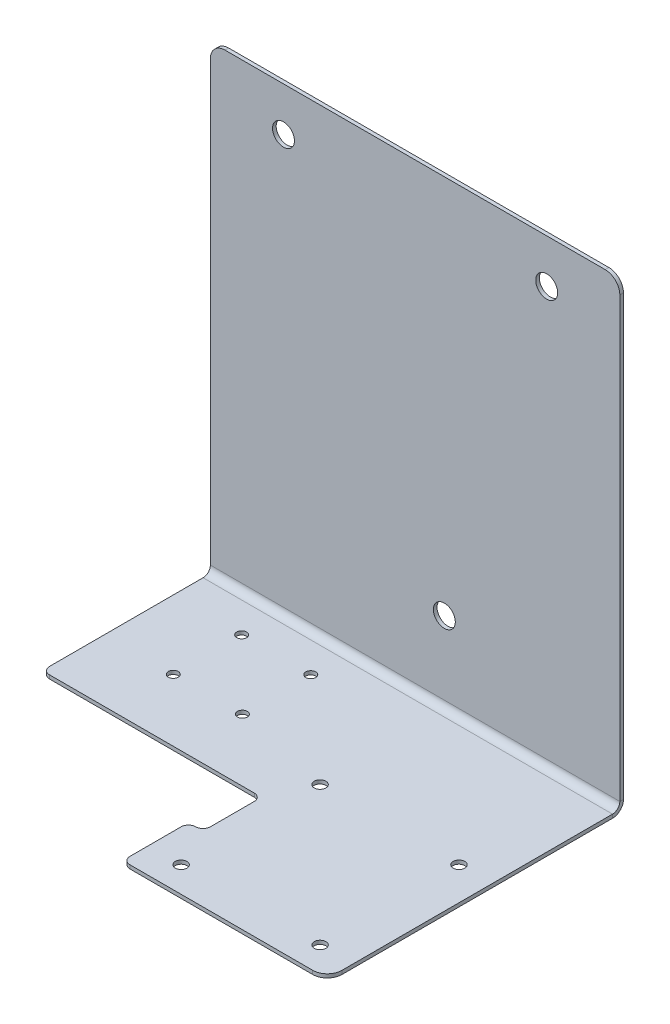
ISO-10303-21;
HEADER;
FILE_DESCRIPTION(('STEP AP214'),'2;1');
FILE_NAME('part.step','',(''),(''),'','','');
FILE_SCHEMA(('AUTOMOTIVE_DESIGN { 1 0 10303 214 1 1 1 1 }'));
ENDSEC;
DATA;
#1=APPLICATION_CONTEXT('core data for automotive mechanical design processes');
#2=APPLICATION_PROTOCOL_DEFINITION('international standard','automotive_design',2000,#1);
#3=PRODUCT_CONTEXT('',#1,'mechanical');
#4=PRODUCT('Part','Part','',(#3));
#5=PRODUCT_RELATED_PRODUCT_CATEGORY('part','',(#4));
#6=PRODUCT_DEFINITION_FORMATION('','',#4);
#7=PRODUCT_DEFINITION_CONTEXT('part definition',#1,'design');
#8=PRODUCT_DEFINITION('design','',#6,#7);
#9=PRODUCT_DEFINITION_SHAPE('','',#8);
#10=(LENGTH_UNIT() NAMED_UNIT(*) SI_UNIT(.MILLI.,.METRE.));
#11=(NAMED_UNIT(*) PLANE_ANGLE_UNIT() SI_UNIT($,.RADIAN.));
#12=(NAMED_UNIT(*) SI_UNIT($,.STERADIAN.) SOLID_ANGLE_UNIT());
#13=UNCERTAINTY_MEASURE_WITH_UNIT(LENGTH_MEASURE(1.E-05),#10,'distance_accuracy_value','');
#14=(GEOMETRIC_REPRESENTATION_CONTEXT(3) GLOBAL_UNCERTAINTY_ASSIGNED_CONTEXT((#13)) GLOBAL_UNIT_ASSIGNED_CONTEXT((#10,
#11,#12)) REPRESENTATION_CONTEXT('',''));
#15=CARTESIAN_POINT('',(0.,0.,0.));
#16=DIRECTION('',(0.,0.,1.));
#17=DIRECTION('',(1.,0.,0.));
#18=AXIS2_PLACEMENT_3D('',#15,#16,#17);
#19=CARTESIAN_POINT('',(82.55,95.25,3.175));
#20=DIRECTION('',(0.,0.,-1.));
#21=DIRECTION('',(-1.,0.,0.));
#22=AXIS2_PLACEMENT_3D('',#19,#20,#21);
#23=CYLINDRICAL_SURFACE('',#22,6.35);
#24=DIRECTION('',(0.,0.,1.));
#25=VECTOR('',#24,1.);
#26=CARTESIAN_POINT('',(88.9,95.25,3.175));
#27=LINE('',#26,#25);
#28=CARTESIAN_POINT('',(88.9,95.25,1.5875));
#29=VERTEX_POINT('',#28);
#30=CARTESIAN_POINT('',(88.9,95.25,3.175));
#31=VERTEX_POINT('',#30);
#32=EDGE_CURVE('E13',#29,#31,#27,.T.);
#33=ORIENTED_EDGE('',*,*,#32,.F.);
#34=CARTESIAN_POINT('',(82.55,95.25,1.5875));
#35=DIRECTION('',(0.,0.,-1.));
#36=DIRECTION('',(-1.,0.,0.));
#37=AXIS2_PLACEMENT_3D('',#34,#35,#36);
#38=CIRCLE('',#37,6.35);
#39=CARTESIAN_POINT('',(82.55,101.6,1.5875));
#40=VERTEX_POINT('',#39);
#41=EDGE_CURVE('E133',#29,#40,#38,.F.);
#42=ORIENTED_EDGE('',*,*,#41,.T.);
#43=DIRECTION('',(0.,0.,1.));
#44=VECTOR('',#43,1.);
#45=CARTESIAN_POINT('',(82.55,101.6,3.175));
#46=LINE('',#45,#44);
#47=CARTESIAN_POINT('',(82.55,101.6,3.175));
#48=VERTEX_POINT('',#47);
#49=EDGE_CURVE('E61',#40,#48,#46,.T.);
#50=ORIENTED_EDGE('',*,*,#49,.T.);
#51=CARTESIAN_POINT('',(82.55,95.25,3.175));
#52=DIRECTION('',(0.,0.,-1.));
#53=DIRECTION('',(-1.,0.,0.));
#54=AXIS2_PLACEMENT_3D('',#51,#52,#53);
#55=CIRCLE('',#54,6.35);
#56=EDGE_CURVE('E135',#31,#48,#55,.F.);
#57=ORIENTED_EDGE('',*,*,#56,.F.);
#58=EDGE_LOOP('',(#33,#42,#50,#57));
#59=FACE_BOUND('',#58,.T.);
#60=ADVANCED_FACE('F51',(#59),#23,.T.);
#61=CARTESIAN_POINT('',(-88.9,101.6,3.175));
#62=DIRECTION('',(0.,-1.,0.));
#63=DIRECTION('',(-1.,0.,0.));
#64=AXIS2_PLACEMENT_3D('',#61,#62,#63);
#65=PLANE('',#64);
#66=ORIENTED_EDGE('',*,*,#49,.F.);
#67=DIRECTION('',(-1.,0.,0.));
#68=VECTOR('',#67,1.);
#69=CARTESIAN_POINT('',(0.,101.6,1.5875));
#70=LINE('',#69,#68);
#71=CARTESIAN_POINT('',(-82.55,101.6,1.5875));
#72=VERTEX_POINT('',#71);
#73=EDGE_CURVE('E149',#40,#72,#70,.T.);
#74=ORIENTED_EDGE('',*,*,#73,.T.);
#75=DIRECTION('',(0.,0.,1.));
#76=VECTOR('',#75,1.);
#77=CARTESIAN_POINT('',(-82.55,101.6,3.175));
#78=LINE('',#77,#76);
#79=CARTESIAN_POINT('',(-82.55,101.6,3.175));
#80=VERTEX_POINT('',#79);
#81=EDGE_CURVE('E235',#72,#80,#78,.T.);
#82=ORIENTED_EDGE('',*,*,#81,.T.);
#83=DIRECTION('',(-1.,0.,0.));
#84=VECTOR('',#83,1.);
#85=CARTESIAN_POINT('',(-88.9,101.6,3.175));
#86=LINE('',#85,#84);
#87=EDGE_CURVE('E247',#48,#80,#86,.T.);
#88=ORIENTED_EDGE('',*,*,#87,.F.);
#89=EDGE_LOOP('',(#66,#74,#82,#88));
#90=FACE_BOUND('',#89,.T.);
#91=ADVANCED_FACE('F252',(#90),#65,.F.);
#92=CARTESIAN_POINT('',(-82.55,95.25,3.175));
#93=DIRECTION('',(0.,0.,-1.));
#94=DIRECTION('',(-1.,0.,0.));
#95=AXIS2_PLACEMENT_3D('',#92,#93,#94);
#96=CYLINDRICAL_SURFACE('',#95,6.35);
#97=ORIENTED_EDGE('',*,*,#81,.F.);
#98=CARTESIAN_POINT('',(-82.55,95.25,1.5875));
#99=DIRECTION('',(0.,0.,-1.));
#100=DIRECTION('',(-1.,0.,0.));
#101=AXIS2_PLACEMENT_3D('',#98,#99,#100);
#102=CIRCLE('',#101,6.35);
#103=CARTESIAN_POINT('',(-88.9,95.25,1.5875));
#104=VERTEX_POINT('',#103);
#105=EDGE_CURVE('E379',#72,#104,#102,.F.);
#106=ORIENTED_EDGE('',*,*,#105,.T.);
#107=DIRECTION('',(0.,0.,1.));
#108=VECTOR('',#107,1.);
#109=CARTESIAN_POINT('',(-88.9,95.25,3.175));
#110=LINE('',#109,#108);
#111=CARTESIAN_POINT('',(-88.9,95.25,3.175));
#112=VERTEX_POINT('',#111);
#113=EDGE_CURVE('E232',#104,#112,#110,.T.);
#114=ORIENTED_EDGE('',*,*,#113,.T.);
#115=CARTESIAN_POINT('',(-82.55,95.25,3.175));
#116=DIRECTION('',(0.,0.,-1.));
#117=DIRECTION('',(-1.,0.,0.));
#118=AXIS2_PLACEMENT_3D('',#115,#116,#117);
#119=CIRCLE('',#118,6.35);
#120=EDGE_CURVE('E253',#80,#112,#119,.F.);
#121=ORIENTED_EDGE('',*,*,#120,.F.);
#122=EDGE_LOOP('',(#97,#106,#114,#121));
#123=FACE_BOUND('',#122,.T.);
#124=ADVANCED_FACE('F382',(#123),#96,.T.);
#125=CARTESIAN_POINT('',(-88.9,-101.6,3.175));
#126=DIRECTION('',(1.,0.,0.));
#127=DIRECTION('',(0.,-1.,0.));
#128=AXIS2_PLACEMENT_3D('',#125,#126,#127);
#129=PLANE('',#128);
#130=ORIENTED_EDGE('',*,*,#113,.F.);
#131=DIRECTION('',(0.,1.,0.));
#132=VECTOR('',#131,1.);
#133=CARTESIAN_POINT('',(-88.9,0.,1.5875));
#134=LINE('',#133,#132);
#135=CARTESIAN_POINT('',(-88.9,-95.25,1.5875));
#136=VERTEX_POINT('',#135);
#137=EDGE_CURVE('E331',#104,#136,#134,.F.);
#138=ORIENTED_EDGE('',*,*,#137,.T.);
#139=DIRECTION('',(0.,0.,1.));
#140=VECTOR('',#139,1.);
#141=CARTESIAN_POINT('',(-88.9,-95.25,3.175));
#142=LINE('',#141,#140);
#143=CARTESIAN_POINT('',(-88.9,-95.25,3.175));
#144=VERTEX_POINT('',#143);
#145=EDGE_CURVE('E229',#136,#144,#142,.T.);
#146=ORIENTED_EDGE('',*,*,#145,.T.);
#147=DIRECTION('',(0.,-1.,0.));
#148=VECTOR('',#147,1.);
#149=CARTESIAN_POINT('',(-88.9,-101.6,3.175));
#150=LINE('',#149,#148);
#151=EDGE_CURVE('E255',#112,#144,#150,.T.);
#152=ORIENTED_EDGE('',*,*,#151,.F.);
#153=EDGE_LOOP('',(#130,#138,#146,#152));
#154=FACE_BOUND('',#153,.T.);
#155=ADVANCED_FACE('F386',(#154),#129,.F.);
#156=CARTESIAN_POINT('',(-88.9,-95.25,6.34999999999999));
#157=DIRECTION('',(-1.,0.,0.));
#158=DIRECTION('',(0.,0.,1.));
#159=AXIS2_PLACEMENT_3D('',#156,#157,#158);
#160=PLANE('',#159);
#161=ORIENTED_EDGE('',*,*,#145,.F.);
#162=CARTESIAN_POINT('',(-88.9,-95.25,6.34999999999999));
#163=DIRECTION('',(1.,0.,0.));
#164=DIRECTION('',(0.,0.,-1.));
#165=AXIS2_PLACEMENT_3D('',#162,#163,#164);
#166=CIRCLE('',#165,4.7625);
#167=CARTESIAN_POINT('',(-88.9,-100.0125,6.35));
#168=VERTEX_POINT('',#167);
#169=EDGE_CURVE('E339',#168,#136,#166,.T.);
#170=ORIENTED_EDGE('',*,*,#169,.F.);
#171=DIRECTION('',(0.,1.,0.));
#172=VECTOR('',#171,1.);
#173=CARTESIAN_POINT('',(-88.9,-98.425,6.34999999999999));
#174=LINE('',#173,#172);
#175=CARTESIAN_POINT('',(-88.9,-98.425,6.34999999999999));
#176=VERTEX_POINT('',#175);
#177=EDGE_CURVE('E69',#168,#176,#174,.T.);
#178=ORIENTED_EDGE('',*,*,#177,.T.);
#179=CARTESIAN_POINT('',(-88.9,-95.25,6.34999999999999));
#180=DIRECTION('',(1.,0.,0.));
#181=DIRECTION('',(0.,0.,-1.));
#182=AXIS2_PLACEMENT_3D('',#179,#180,#181);
#183=CIRCLE('',#182,3.175);
#184=EDGE_CURVE('E328',#176,#144,#183,.T.);
#185=ORIENTED_EDGE('',*,*,#184,.T.);
#186=EDGE_LOOP('',(#161,#170,#178,#185));
#187=FACE_BOUND('',#186,.T.);
#188=ADVANCED_FACE('F392',(#187),#160,.T.);
#189=CARTESIAN_POINT('',(-88.9,-98.425,130.175));
#190=DIRECTION('',(-1.,0.,0.));
#191=DIRECTION('',(0.,0.,-1.));
#192=AXIS2_PLACEMENT_3D('',#189,#190,#191);
#193=PLANE('',#192);
#194=ORIENTED_EDGE('',*,*,#177,.F.);
#195=DIRECTION('',(0.,0.,-1.));
#196=VECTOR('',#195,1.);
#197=CARTESIAN_POINT('',(-88.9,-100.0125,130.175));
#198=LINE('',#197,#196);
#199=CARTESIAN_POINT('',(-88.9,-100.0125,73.025));
#200=VERTEX_POINT('',#199);
#201=EDGE_CURVE('E187',#200,#168,#198,.T.);
#202=ORIENTED_EDGE('',*,*,#201,.F.);
#203=DIRECTION('',(0.,1.,0.));
#204=VECTOR('',#203,1.);
#205=CARTESIAN_POINT('',(-88.9,-98.425,73.025));
#206=LINE('',#205,#204);
#207=CARTESIAN_POINT('',(-88.9,-98.425,73.025));
#208=VERTEX_POINT('',#207);
#209=EDGE_CURVE('E225',#200,#208,#206,.T.);
#210=ORIENTED_EDGE('',*,*,#209,.T.);
#211=DIRECTION('',(0.,0.,-1.));
#212=VECTOR('',#211,1.);
#213=CARTESIAN_POINT('',(-88.9,-98.425,130.175));
#214=LINE('',#213,#212);
#215=EDGE_CURVE('E287',#208,#176,#214,.T.);
#216=ORIENTED_EDGE('',*,*,#215,.T.);
#217=EDGE_LOOP('',(#194,#202,#210,#216));
#218=FACE_BOUND('',#217,.T.);
#219=ADVANCED_FACE('F443',(#218),#193,.T.);
#220=CARTESIAN_POINT('',(-85.725,-98.425,73.025));
#221=DIRECTION('',(0.,-1.,0.));
#222=DIRECTION('',(0.,0.,-1.));
#223=AXIS2_PLACEMENT_3D('',#220,#221,#222);
#224=CYLINDRICAL_SURFACE('',#223,3.175);
#225=ORIENTED_EDGE('',*,*,#209,.F.);
#226=CARTESIAN_POINT('',(-85.725,-100.0125,73.025));
#227=DIRECTION('',(0.,-1.,0.));
#228=DIRECTION('',(0.,0.,-1.));
#229=AXIS2_PLACEMENT_3D('',#226,#227,#228);
#230=CIRCLE('',#229,3.175);
#231=CARTESIAN_POINT('',(-85.725,-100.0125,76.2));
#232=VERTEX_POINT('',#231);
#233=EDGE_CURVE('E369',#200,#232,#230,.F.);
#234=ORIENTED_EDGE('',*,*,#233,.T.);
#235=DIRECTION('',(0.,1.,0.));
#236=VECTOR('',#235,1.);
#237=CARTESIAN_POINT('',(-85.725,-98.425,76.2));
#238=LINE('',#237,#236);
#239=CARTESIAN_POINT('',(-85.725,-98.425,76.2));
#240=VERTEX_POINT('',#239);
#241=EDGE_CURVE('E222',#232,#240,#238,.T.);
#242=ORIENTED_EDGE('',*,*,#241,.T.);
#243=CARTESIAN_POINT('',(-85.725,-98.425,73.025));
#244=DIRECTION('',(0.,-1.,0.));
#245=DIRECTION('',(0.,0.,-1.));
#246=AXIS2_PLACEMENT_3D('',#243,#244,#245);
#247=CIRCLE('',#246,3.175);
#248=EDGE_CURVE('E289',#208,#240,#247,.F.);
#249=ORIENTED_EDGE('',*,*,#248,.F.);
#250=EDGE_LOOP('',(#225,#234,#242,#249));
#251=FACE_BOUND('',#250,.T.);
#252=ADVANCED_FACE('F447',(#251),#224,.T.);
#253=CARTESIAN_POINT('',(-88.9,-98.425,76.2));
#254=DIRECTION('',(0.,0.,-1.));
#255=DIRECTION('',(1.,0.,0.));
#256=AXIS2_PLACEMENT_3D('',#253,#254,#255);
#257=PLANE('',#256);
#258=ORIENTED_EDGE('',*,*,#241,.F.);
#259=DIRECTION('',(1.,0.,0.));
#260=VECTOR('',#259,1.);
#261=CARTESIAN_POINT('',(-88.9,-100.0125,76.2));
#262=LINE('',#261,#260);
#263=CARTESIAN_POINT('',(3.175,-100.0125,76.2));
#264=VERTEX_POINT('',#263);
#265=EDGE_CURVE('E366',#232,#264,#262,.T.);
#266=ORIENTED_EDGE('',*,*,#265,.T.);
#267=DIRECTION('',(0.,1.,0.));
#268=VECTOR('',#267,1.);
#269=CARTESIAN_POINT('',(3.175,-98.425,76.2));
#270=LINE('',#269,#268);
#271=CARTESIAN_POINT('',(3.175,-98.425,76.2));
#272=VERTEX_POINT('',#271);
#273=EDGE_CURVE('E219',#264,#272,#270,.T.);
#274=ORIENTED_EDGE('',*,*,#273,.T.);
#275=DIRECTION('',(1.,0.,0.));
#276=VECTOR('',#275,1.);
#277=CARTESIAN_POINT('',(-88.9,-98.425,76.2));
#278=LINE('',#277,#276);
#279=EDGE_CURVE('E292',#240,#272,#278,.T.);
#280=ORIENTED_EDGE('',*,*,#279,.F.);
#281=EDGE_LOOP('',(#258,#266,#274,#280));
#282=FACE_BOUND('',#281,.T.);
#283=ADVANCED_FACE('F449',(#282),#257,.F.);
#284=CARTESIAN_POINT('',(3.17499999999999,-98.425,79.375));
#285=DIRECTION('',(0.,-1.,0.));
#286=DIRECTION('',(0.,0.,-1.));
#287=AXIS2_PLACEMENT_3D('',#284,#285,#286);
#288=CYLINDRICAL_SURFACE('',#287,3.175);
#289=ORIENTED_EDGE('',*,*,#273,.F.);
#290=CARTESIAN_POINT('',(3.17499999999999,-100.0125,79.375));
#291=DIRECTION('',(0.,-1.,0.));
#292=DIRECTION('',(0.,0.,-1.));
#293=AXIS2_PLACEMENT_3D('',#290,#291,#292);
#294=CIRCLE('',#293,3.175);
#295=CARTESIAN_POINT('',(6.34999999999999,-100.0125,79.375));
#296=VERTEX_POINT('',#295);
#297=EDGE_CURVE('E363',#264,#296,#294,.T.);
#298=ORIENTED_EDGE('',*,*,#297,.T.);
#299=DIRECTION('',(0.,1.,0.));
#300=VECTOR('',#299,1.);
#301=CARTESIAN_POINT('',(6.35,-98.425,79.375));
#302=LINE('',#301,#300);
#303=CARTESIAN_POINT('',(6.35,-98.425,79.375));
#304=VERTEX_POINT('',#303);
#305=EDGE_CURVE('E216',#296,#304,#302,.T.);
#306=ORIENTED_EDGE('',*,*,#305,.T.);
#307=CARTESIAN_POINT('',(3.17499999999999,-98.425,79.375));
#308=DIRECTION('',(0.,-1.,0.));
#309=DIRECTION('',(0.,0.,-1.));
#310=AXIS2_PLACEMENT_3D('',#307,#308,#309);
#311=CIRCLE('',#310,3.175);
#312=EDGE_CURVE('E295',#272,#304,#311,.T.);
#313=ORIENTED_EDGE('',*,*,#312,.F.);
#314=EDGE_LOOP('',(#289,#298,#306,#313));
#315=FACE_BOUND('',#314,.T.);
#316=ADVANCED_FACE('F454',(#315),#288,.F.);
#317=CARTESIAN_POINT('',(6.35000000000001,-98.425,130.175));
#318=DIRECTION('',(1.,0.,0.));
#319=DIRECTION('',(0.,0.,1.));
#320=AXIS2_PLACEMENT_3D('',#317,#318,#319);
#321=PLANE('',#320);
#322=ORIENTED_EDGE('',*,*,#305,.F.);
#323=DIRECTION('',(0.,0.,-1.));
#324=VECTOR('',#323,1.);
#325=CARTESIAN_POINT('',(6.34999999999999,-100.0125,130.175));
#326=LINE('',#325,#324);
#327=CARTESIAN_POINT('',(6.35000000000001,-100.0125,98.425));
#328=VERTEX_POINT('',#327);
#329=EDGE_CURVE('E360',#296,#328,#326,.F.);
#330=ORIENTED_EDGE('',*,*,#329,.T.);
#331=DIRECTION('',(0.,1.,0.));
#332=VECTOR('',#331,1.);
#333=CARTESIAN_POINT('',(6.35,-98.425,98.425));
#334=LINE('',#333,#332);
#335=CARTESIAN_POINT('',(6.35,-98.425,98.425));
#336=VERTEX_POINT('',#335);
#337=EDGE_CURVE('E213',#328,#336,#334,.T.);
#338=ORIENTED_EDGE('',*,*,#337,.T.);
#339=DIRECTION('',(0.,0.,1.));
#340=VECTOR('',#339,1.);
#341=CARTESIAN_POINT('',(6.35000000000001,-98.425,130.175));
#342=LINE('',#341,#340);
#343=EDGE_CURVE('E298',#304,#336,#342,.T.);
#344=ORIENTED_EDGE('',*,*,#343,.F.);
#345=EDGE_LOOP('',(#322,#330,#338,#344));
#346=FACE_BOUND('',#345,.T.);
#347=ADVANCED_FACE('F459',(#346),#321,.F.);
#348=CARTESIAN_POINT('',(3.175,-98.425,98.425));
#349=DIRECTION('',(0.,-1.,0.));
#350=DIRECTION('',(0.,0.,-1.));
#351=AXIS2_PLACEMENT_3D('',#348,#349,#350);
#352=CYLINDRICAL_SURFACE('',#351,3.175);
#353=ORIENTED_EDGE('',*,*,#337,.F.);
#354=CARTESIAN_POINT('',(3.175,-100.0125,98.425));
#355=DIRECTION('',(0.,-1.,0.));
#356=DIRECTION('',(0.,0.,-1.));
#357=AXIS2_PLACEMENT_3D('',#354,#355,#356);
#358=CIRCLE('',#357,3.175);
#359=CARTESIAN_POINT('',(3.17499999999991,-100.0125,101.6));
#360=VERTEX_POINT('',#359);
#361=EDGE_CURVE('E357',#328,#360,#358,.T.);
#362=ORIENTED_EDGE('',*,*,#361,.T.);
#363=DIRECTION('',(0.,1.,0.));
#364=VECTOR('',#363,1.);
#365=CARTESIAN_POINT('',(3.17499999999991,-98.425,101.6));
#366=LINE('',#365,#364);
#367=CARTESIAN_POINT('',(3.17499999999991,-98.425,101.6));
#368=VERTEX_POINT('',#367);
#369=EDGE_CURVE('E210',#360,#368,#366,.T.);
#370=ORIENTED_EDGE('',*,*,#369,.T.);
#371=CARTESIAN_POINT('',(3.175,-98.425,98.425));
#372=DIRECTION('',(0.,-1.,0.));
#373=DIRECTION('',(0.,0.,-1.));
#374=AXIS2_PLACEMENT_3D('',#371,#372,#373);
#375=CIRCLE('',#374,3.175);
#376=EDGE_CURVE('E301',#336,#368,#375,.T.);
#377=ORIENTED_EDGE('',*,*,#376,.F.);
#378=EDGE_LOOP('',(#353,#362,#370,#377));
#379=FACE_BOUND('',#378,.T.);
#380=ADVANCED_FACE('F461',(#379),#352,.F.);
#381=CARTESIAN_POINT('',(3.17499999999992,-98.425,104.775));
#382=DIRECTION('',(0.,-1.,0.));
#383=DIRECTION('',(0.,0.,-1.));
#384=AXIS2_PLACEMENT_3D('',#381,#382,#383);
#385=CYLINDRICAL_SURFACE('',#384,3.175);
#386=ORIENTED_EDGE('',*,*,#369,.F.);
#387=CARTESIAN_POINT('',(3.17499999999992,-100.0125,104.775));
#388=DIRECTION('',(0.,-1.,0.));
#389=DIRECTION('',(0.,0.,-1.));
#390=AXIS2_PLACEMENT_3D('',#387,#388,#389);
#391=CIRCLE('',#390,3.175);
#392=CARTESIAN_POINT('',(0.,-100.0125,104.775));
#393=VERTEX_POINT('',#392);
#394=EDGE_CURVE('E354',#360,#393,#391,.F.);
#395=ORIENTED_EDGE('',*,*,#394,.T.);
#396=DIRECTION('',(0.,1.,0.));
#397=VECTOR('',#396,1.);
#398=CARTESIAN_POINT('',(0.,-98.425,104.775));
#399=LINE('',#398,#397);
#400=CARTESIAN_POINT('',(0.,-98.425,104.775));
#401=VERTEX_POINT('',#400);
#402=EDGE_CURVE('E207',#393,#401,#399,.T.);
#403=ORIENTED_EDGE('',*,*,#402,.T.);
#404=CARTESIAN_POINT('',(3.17499999999992,-98.425,104.775));
#405=DIRECTION('',(0.,-1.,0.));
#406=DIRECTION('',(0.,0.,-1.));
#407=AXIS2_PLACEMENT_3D('',#404,#405,#406);
#408=CIRCLE('',#407,3.175);
#409=EDGE_CURVE('E304',#368,#401,#408,.F.);
#410=ORIENTED_EDGE('',*,*,#409,.F.);
#411=EDGE_LOOP('',(#386,#395,#403,#410));
#412=FACE_BOUND('',#411,.T.);
#413=ADVANCED_FACE('F466',(#412),#385,.T.);
#414=CARTESIAN_POINT('',(0.,-98.425,130.175));
#415=DIRECTION('',(1.,0.,0.));
#416=DIRECTION('',(0.,0.,1.));
#417=AXIS2_PLACEMENT_3D('',#414,#415,#416);
#418=PLANE('',#417);
#419=ORIENTED_EDGE('',*,*,#402,.F.);
#420=DIRECTION('',(0.,0.,-1.));
#421=VECTOR('',#420,1.);
#422=CARTESIAN_POINT('',(0.,-100.0125,130.175));
#423=LINE('',#422,#421);
#424=CARTESIAN_POINT('',(0.,-100.0125,127.));
#425=VERTEX_POINT('',#424);
#426=EDGE_CURVE('E351',#393,#425,#423,.F.);
#427=ORIENTED_EDGE('',*,*,#426,.T.);
#428=DIRECTION('',(0.,1.,0.));
#429=VECTOR('',#428,1.);
#430=CARTESIAN_POINT('',(0.,-98.425,127.));
#431=LINE('',#430,#429);
#432=CARTESIAN_POINT('',(0.,-98.425,127.));
#433=VERTEX_POINT('',#432);
#434=EDGE_CURVE('E204',#425,#433,#431,.T.);
#435=ORIENTED_EDGE('',*,*,#434,.T.);
#436=DIRECTION('',(0.,0.,1.));
#437=VECTOR('',#436,1.);
#438=CARTESIAN_POINT('',(0.,-98.425,130.175));
#439=LINE('',#438,#437);
#440=EDGE_CURVE('E307',#401,#433,#439,.T.);
#441=ORIENTED_EDGE('',*,*,#440,.F.);
#442=EDGE_LOOP('',(#419,#427,#435,#441));
#443=FACE_BOUND('',#442,.T.);
#444=ADVANCED_FACE('F471',(#443),#418,.F.);
#445=CARTESIAN_POINT('',(3.17499999999992,-98.425,127.));
#446=DIRECTION('',(0.,-1.,0.));
#447=DIRECTION('',(0.,0.,-1.));
#448=AXIS2_PLACEMENT_3D('',#445,#446,#447);
#449=CYLINDRICAL_SURFACE('',#448,3.175);
#450=ORIENTED_EDGE('',*,*,#434,.F.);
#451=CARTESIAN_POINT('',(3.17499999999992,-100.0125,127.));
#452=DIRECTION('',(0.,-1.,0.));
#453=DIRECTION('',(0.,0.,-1.));
#454=AXIS2_PLACEMENT_3D('',#451,#452,#453);
#455=CIRCLE('',#454,3.175);
#456=CARTESIAN_POINT('',(3.17499999999991,-100.0125,130.175));
#457=VERTEX_POINT('',#456);
#458=EDGE_CURVE('E348',#425,#457,#455,.F.);
#459=ORIENTED_EDGE('',*,*,#458,.T.);
#460=DIRECTION('',(0.,1.,0.));
#461=VECTOR('',#460,1.);
#462=CARTESIAN_POINT('',(3.17499999999991,-98.425,130.175));
#463=LINE('',#462,#461);
#464=CARTESIAN_POINT('',(3.17499999999991,-98.425,130.175));
#465=VERTEX_POINT('',#464);
#466=EDGE_CURVE('E201',#457,#465,#463,.T.);
#467=ORIENTED_EDGE('',*,*,#466,.T.);
#468=CARTESIAN_POINT('',(3.17499999999992,-98.425,127.));
#469=DIRECTION('',(0.,-1.,0.));
#470=DIRECTION('',(0.,0.,-1.));
#471=AXIS2_PLACEMENT_3D('',#468,#469,#470);
#472=CIRCLE('',#471,3.175);
#473=EDGE_CURVE('E310',#433,#465,#472,.F.);
#474=ORIENTED_EDGE('',*,*,#473,.F.);
#475=EDGE_LOOP('',(#450,#459,#467,#474));
#476=FACE_BOUND('',#475,.T.);
#477=ADVANCED_FACE('F473',(#476),#449,.T.);
#478=CARTESIAN_POINT('',(-88.9,-98.425,130.175));
#479=DIRECTION('',(0.,0.,1.));
#480=DIRECTION('',(-1.,0.,0.));
#481=AXIS2_PLACEMENT_3D('',#478,#479,#480);
#482=PLANE('',#481);
#483=ORIENTED_EDGE('',*,*,#466,.F.);
#484=DIRECTION('',(1.,0.,0.));
#485=VECTOR('',#484,1.);
#486=CARTESIAN_POINT('',(-88.9,-100.0125,130.175));
#487=LINE('',#486,#485);
#488=CARTESIAN_POINT('',(82.55,-100.0125,130.175));
#489=VERTEX_POINT('',#488);
#490=EDGE_CURVE('E345',#489,#457,#487,.F.);
#491=ORIENTED_EDGE('',*,*,#490,.F.);
#492=DIRECTION('',(0.,1.,0.));
#493=VECTOR('',#492,1.);
#494=CARTESIAN_POINT('',(82.55,-98.425,130.175));
#495=LINE('',#494,#493);
#496=CARTESIAN_POINT('',(82.55,-98.425,130.175));
#497=VERTEX_POINT('',#496);
#498=EDGE_CURVE('E198',#489,#497,#495,.T.);
#499=ORIENTED_EDGE('',*,*,#498,.T.);
#500=DIRECTION('',(-1.,0.,0.));
#501=VECTOR('',#500,1.);
#502=CARTESIAN_POINT('',(-88.9,-98.425,130.175));
#503=LINE('',#502,#501);
#504=EDGE_CURVE('E313',#497,#465,#503,.T.);
#505=ORIENTED_EDGE('',*,*,#504,.T.);
#506=EDGE_LOOP('',(#483,#491,#499,#505));
#507=FACE_BOUND('',#506,.T.);
#508=ADVANCED_FACE('F476',(#507),#482,.T.);
#509=CARTESIAN_POINT('',(82.55,-98.425,123.825));
#510=DIRECTION('',(0.,-1.,0.));
#511=DIRECTION('',(0.,0.,-1.));
#512=AXIS2_PLACEMENT_3D('',#509,#510,#511);
#513=CYLINDRICAL_SURFACE('',#512,6.35);
#514=ORIENTED_EDGE('',*,*,#498,.F.);
#515=CARTESIAN_POINT('',(82.55,-100.0125,123.825));
#516=DIRECTION('',(0.,-1.,0.));
#517=DIRECTION('',(0.,0.,-1.));
#518=AXIS2_PLACEMENT_3D('',#515,#516,#517);
#519=CIRCLE('',#518,6.35);
#520=CARTESIAN_POINT('',(88.9,-100.0125,123.825));
#521=VERTEX_POINT('',#520);
#522=EDGE_CURVE('E342',#489,#521,#519,.F.);
#523=ORIENTED_EDGE('',*,*,#522,.T.);
#524=DIRECTION('',(0.,1.,0.));
#525=VECTOR('',#524,1.);
#526=CARTESIAN_POINT('',(88.9,-98.425,123.825));
#527=LINE('',#526,#525);
#528=CARTESIAN_POINT('',(88.9,-98.425,123.825));
#529=VERTEX_POINT('',#528);
#530=EDGE_CURVE('E195',#521,#529,#527,.T.);
#531=ORIENTED_EDGE('',*,*,#530,.T.);
#532=CARTESIAN_POINT('',(82.55,-98.425,123.825));
#533=DIRECTION('',(0.,-1.,0.));
#534=DIRECTION('',(0.,0.,-1.));
#535=AXIS2_PLACEMENT_3D('',#532,#533,#534);
#536=CIRCLE('',#535,6.35);
#537=EDGE_CURVE('E316',#497,#529,#536,.F.);
#538=ORIENTED_EDGE('',*,*,#537,.F.);
#539=EDGE_LOOP('',(#514,#523,#531,#538));
#540=FACE_BOUND('',#539,.T.);
#541=ADVANCED_FACE('F426',(#540),#513,.T.);
#542=CARTESIAN_POINT('',(88.9,-98.425,130.175));
#543=DIRECTION('',(-1.,0.,0.));
#544=DIRECTION('',(0.,0.,-1.));
#545=AXIS2_PLACEMENT_3D('',#542,#543,#544);
#546=PLANE('',#545);
#547=ORIENTED_EDGE('',*,*,#530,.F.);
#548=DIRECTION('',(0.,0.,-1.));
#549=VECTOR('',#548,1.);
#550=CARTESIAN_POINT('',(88.9,-100.0125,130.175));
#551=LINE('',#550,#549);
#552=CARTESIAN_POINT('',(88.9,-100.0125,6.34999999999999));
#553=VERTEX_POINT('',#552);
#554=EDGE_CURVE('E336',#521,#553,#551,.T.);
#555=ORIENTED_EDGE('',*,*,#554,.T.);
#556=DIRECTION('',(0.,1.,0.));
#557=VECTOR('',#556,1.);
#558=CARTESIAN_POINT('',(88.9,-98.425,6.34999999999999));
#559=LINE('',#558,#557);
#560=CARTESIAN_POINT('',(88.9,-98.425,6.34999999999999));
#561=VERTEX_POINT('',#560);
#562=EDGE_CURVE('E193',#553,#561,#559,.T.);
#563=ORIENTED_EDGE('',*,*,#562,.T.);
#564=DIRECTION('',(0.,0.,-1.));
#565=VECTOR('',#564,1.);
#566=CARTESIAN_POINT('',(88.9,-98.425,130.175));
#567=LINE('',#566,#565);
#568=EDGE_CURVE('E319',#529,#561,#567,.T.);
#569=ORIENTED_EDGE('',*,*,#568,.F.);
#570=EDGE_LOOP('',(#547,#555,#563,#569));
#571=FACE_BOUND('',#570,.T.);
#572=ADVANCED_FACE('F435',(#571),#546,.F.);
#573=CARTESIAN_POINT('',(88.9,-95.25,6.34999999999999));
#574=DIRECTION('',(1.,0.,0.));
#575=DIRECTION('',(0.,0.,-1.));
#576=AXIS2_PLACEMENT_3D('',#573,#574,#575);
#577=PLANE('',#576);
#578=ORIENTED_EDGE('',*,*,#562,.F.);
#579=CARTESIAN_POINT('',(88.9,-95.25,6.34999999999999));
#580=DIRECTION('',(1.,0.,0.));
#581=DIRECTION('',(0.,0.,-1.));
#582=AXIS2_PLACEMENT_3D('',#579,#580,#581);
#583=CIRCLE('',#582,4.7625);
#584=CARTESIAN_POINT('',(88.9,-95.25,1.5875));
#585=VERTEX_POINT('',#584);
#586=EDGE_CURVE('E335',#585,#553,#583,.F.);
#587=ORIENTED_EDGE('',*,*,#586,.F.);
#588=DIRECTION('',(0.,0.,1.));
#589=VECTOR('',#588,1.);
#590=CARTESIAN_POINT('',(88.9,-95.25,3.175));
#591=LINE('',#590,#589);
#592=CARTESIAN_POINT('',(88.9,-95.25,3.175));
#593=VERTEX_POINT('',#592);
#594=EDGE_CURVE('E55',#585,#593,#591,.T.);
#595=ORIENTED_EDGE('',*,*,#594,.T.);
#596=CARTESIAN_POINT('',(88.9,-95.25,6.34999999999999));
#597=DIRECTION('',(-1.,0.,0.));
#598=DIRECTION('',(0.,0.,1.));
#599=AXIS2_PLACEMENT_3D('',#596,#597,#598);
#600=CIRCLE('',#599,3.175);
#601=EDGE_CURVE('E325',#593,#561,#600,.T.);
#602=ORIENTED_EDGE('',*,*,#601,.T.);
#603=EDGE_LOOP('',(#578,#587,#595,#602));
#604=FACE_BOUND('',#603,.T.);
#605=ADVANCED_FACE('F436',(#604),#577,.T.);
#606=CARTESIAN_POINT('',(-57.15,82.55,3.175));
#607=DIRECTION('',(0.,0.,-1.));
#608=DIRECTION('',(-1.,0.,0.));
#609=AXIS2_PLACEMENT_3D('',#606,#607,#608);
#610=CYLINDRICAL_SURFACE('',#609,4.7625);
#611=CARTESIAN_POINT('',(-57.15,82.55,3.175));
#612=DIRECTION('',(0.,0.,1.));
#613=DIRECTION('',(1.,0.,0.));
#614=AXIS2_PLACEMENT_3D('',#611,#612,#613);
#615=CIRCLE('',#614,4.7625);
#616=CARTESIAN_POINT('',(-52.3875,82.55,3.175));
#617=VERTEX_POINT('',#616);
#618=EDGE_CURVE('E376',#617,#617,#615,.T.);
#619=ORIENTED_EDGE('',*,*,#618,.T.);
#620=EDGE_LOOP('',(#619));
#621=FACE_BOUND('',#620,.T.);
#622=CARTESIAN_POINT('',(-57.15,82.55,1.5875));
#623=DIRECTION('',(0.,0.,1.));
#624=DIRECTION('',(1.,0.,0.));
#625=AXIS2_PLACEMENT_3D('',#622,#623,#624);
#626=CIRCLE('',#625,4.7625);
#627=CARTESIAN_POINT('',(-52.3875,82.55,1.5875));
#628=VERTEX_POINT('',#627);
#629=EDGE_CURVE('E188',#628,#628,#626,.T.);
#630=ORIENTED_EDGE('',*,*,#629,.F.);
#631=EDGE_LOOP('',(#630));
#632=FACE_BOUND('',#631,.T.);
#633=ADVANCED_FACE('F527',(#621,#632),#610,.F.);
#634=CARTESIAN_POINT('',(57.15,82.55,3.175));
#635=DIRECTION('',(0.,0.,-1.));
#636=DIRECTION('',(-1.,0.,0.));
#637=AXIS2_PLACEMENT_3D('',#634,#635,#636);
#638=CYLINDRICAL_SURFACE('',#637,4.7625);
#639=CARTESIAN_POINT('',(57.15,82.55,3.175));
#640=DIRECTION('',(0.,0.,1.));
#641=DIRECTION('',(1.,0.,0.));
#642=AXIS2_PLACEMENT_3D('',#639,#640,#641);
#643=CIRCLE('',#642,4.7625);
#644=CARTESIAN_POINT('',(61.9125,82.55,3.175));
#645=VERTEX_POINT('',#644);
#646=EDGE_CURVE('E540',#645,#645,#643,.T.);
#647=ORIENTED_EDGE('',*,*,#646,.T.);
#648=EDGE_LOOP('',(#647));
#649=FACE_BOUND('',#648,.T.);
#650=CARTESIAN_POINT('',(57.15,82.55,1.5875));
#651=DIRECTION('',(0.,0.,1.));
#652=DIRECTION('',(1.,0.,0.));
#653=AXIS2_PLACEMENT_3D('',#650,#651,#652);
#654=CIRCLE('',#653,4.7625);
#655=CARTESIAN_POINT('',(61.9125,82.55,1.5875));
#656=VERTEX_POINT('',#655);
#657=EDGE_CURVE('E158',#656,#656,#654,.T.);
#658=ORIENTED_EDGE('',*,*,#657,.F.);
#659=EDGE_LOOP('',(#658));
#660=FACE_BOUND('',#659,.T.);
#661=ADVANCED_FACE('F529',(#649,#660),#638,.F.);
#662=CARTESIAN_POINT('',(12.7,-63.5,3.175));
#663=DIRECTION('',(0.,0.,-1.));
#664=DIRECTION('',(-1.,0.,0.));
#665=AXIS2_PLACEMENT_3D('',#662,#663,#664);
#666=CYLINDRICAL_SURFACE('',#665,4.76250000000001);
#667=CARTESIAN_POINT('',(12.7,-63.5,3.175));
#668=DIRECTION('',(0.,0.,1.));
#669=DIRECTION('',(1.,0.,0.));
#670=AXIS2_PLACEMENT_3D('',#667,#668,#669);
#671=CIRCLE('',#670,4.76250000000001);
#672=CARTESIAN_POINT('',(17.4625,-63.5,3.175));
#673=VERTEX_POINT('',#672);
#674=EDGE_CURVE('E886',#673,#673,#671,.T.);
#675=ORIENTED_EDGE('',*,*,#674,.T.);
#676=EDGE_LOOP('',(#675));
#677=FACE_BOUND('',#676,.T.);
#678=CARTESIAN_POINT('',(12.7,-63.5,1.5875));
#679=DIRECTION('',(0.,0.,1.));
#680=DIRECTION('',(1.,0.,0.));
#681=AXIS2_PLACEMENT_3D('',#678,#679,#680);
#682=CIRCLE('',#681,4.76250000000001);
#683=CARTESIAN_POINT('',(17.4625,-63.5,1.5875));
#684=VERTEX_POINT('',#683);
#685=EDGE_CURVE('E155',#684,#684,#682,.T.);
#686=ORIENTED_EDGE('',*,*,#685,.F.);
#687=EDGE_LOOP('',(#686));
#688=FACE_BOUND('',#687,.T.);
#689=ADVANCED_FACE('F53',(#677,#688),#666,.F.);
#690=CARTESIAN_POINT('',(-29.05,-98.425,49.1400372285927));
#691=DIRECTION('',(0.,-1.,0.));
#692=DIRECTION('',(0.,0.,-1.));
#693=AXIS2_PLACEMENT_3D('',#690,#691,#692);
#694=CYLINDRICAL_SURFACE('',#693,2.14999999999998);
#695=CARTESIAN_POINT('',(-29.05,-98.425,49.1400372285927));
#696=DIRECTION('',(0.,1.,0.));
#697=DIRECTION('',(0.,0.,1.));
#698=AXIS2_PLACEMENT_3D('',#695,#696,#697);
#699=CIRCLE('',#698,2.14999999999998);
#700=CARTESIAN_POINT('',(-29.05,-98.425,51.2900372285927));
#701=VERTEX_POINT('',#700);
#702=EDGE_CURVE('E263',#701,#701,#699,.T.);
#703=ORIENTED_EDGE('',*,*,#702,.T.);
#704=EDGE_LOOP('',(#703));
#705=FACE_BOUND('',#704,.T.);
#706=CARTESIAN_POINT('',(-29.05,-100.0125,49.1400372285927));
#707=DIRECTION('',(0.,1.,0.));
#708=DIRECTION('',(0.,0.,1.));
#709=AXIS2_PLACEMENT_3D('',#706,#707,#708);
#710=CIRCLE('',#709,2.14999999999998);
#711=CARTESIAN_POINT('',(-29.05,-100.0125,51.2900372285927));
#712=VERTEX_POINT('',#711);
#713=EDGE_CURVE('E162',#712,#712,#710,.T.);
#714=ORIENTED_EDGE('',*,*,#713,.F.);
#715=EDGE_LOOP('',(#714));
#716=FACE_BOUND('',#715,.T.);
#717=ADVANCED_FACE('F496',(#705,#716),#694,.F.);
#718=CARTESIAN_POINT('',(74.6124999999998,-98.425,58.7375));
#719=DIRECTION('',(0.,-1.,0.));
#720=DIRECTION('',(0.,0.,-1.));
#721=AXIS2_PLACEMENT_3D('',#718,#719,#720);
#722=CYLINDRICAL_SURFACE('',#721,2.54);
#723=CARTESIAN_POINT('',(74.6124999999998,-98.425,58.7375));
#724=DIRECTION('',(0.,1.,0.));
#725=DIRECTION('',(0.,0.,1.));
#726=AXIS2_PLACEMENT_3D('',#723,#724,#725);
#727=CIRCLE('',#726,2.54);
#728=CARTESIAN_POINT('',(74.6124999999998,-98.425,61.2775));
#729=VERTEX_POINT('',#728);
#730=EDGE_CURVE('E266',#729,#729,#727,.T.);
#731=ORIENTED_EDGE('',*,*,#730,.T.);
#732=EDGE_LOOP('',(#731));
#733=FACE_BOUND('',#732,.T.);
#734=CARTESIAN_POINT('',(74.6124999999998,-100.0125,58.7375));
#735=DIRECTION('',(0.,1.,0.));
#736=DIRECTION('',(0.,0.,1.));
#737=AXIS2_PLACEMENT_3D('',#734,#735,#736);
#738=CIRCLE('',#737,2.54);
#739=CARTESIAN_POINT('',(74.6124999999998,-100.0125,61.2775));
#740=VERTEX_POINT('',#739);
#741=EDGE_CURVE('E165',#740,#740,#738,.T.);
#742=ORIENTED_EDGE('',*,*,#741,.F.);
#743=EDGE_LOOP('',(#742));
#744=FACE_BOUND('',#743,.T.);
#745=ADVANCED_FACE('F499',(#733,#744),#722,.F.);
#746=CARTESIAN_POINT('',(14.2874999999998,-98.425,58.7375));
#747=DIRECTION('',(0.,-1.,0.));
#748=DIRECTION('',(0.,0.,-1.));
#749=AXIS2_PLACEMENT_3D('',#746,#747,#748);
#750=CYLINDRICAL_SURFACE('',#749,2.54);
#751=CARTESIAN_POINT('',(14.2874999999998,-98.425,58.7375));
#752=DIRECTION('',(0.,1.,0.));
#753=DIRECTION('',(0.,0.,1.));
#754=AXIS2_PLACEMENT_3D('',#751,#752,#753);
#755=CIRCLE('',#754,2.54);
#756=CARTESIAN_POINT('',(14.2874999999998,-98.425,61.2775));
#757=VERTEX_POINT('',#756);
#758=EDGE_CURVE('E269',#757,#757,#755,.T.);
#759=ORIENTED_EDGE('',*,*,#758,.T.);
#760=EDGE_LOOP('',(#759));
#761=FACE_BOUND('',#760,.T.);
#762=CARTESIAN_POINT('',(14.2874999999998,-100.0125,58.7375));
#763=DIRECTION('',(0.,1.,0.));
#764=DIRECTION('',(0.,0.,1.));
#765=AXIS2_PLACEMENT_3D('',#762,#763,#764);
#766=CIRCLE('',#765,2.54);
#767=CARTESIAN_POINT('',(14.2874999999998,-100.0125,61.2775));
#768=VERTEX_POINT('',#767);
#769=EDGE_CURVE('E169',#768,#768,#766,.T.);
#770=ORIENTED_EDGE('',*,*,#769,.F.);
#771=EDGE_LOOP('',(#770));
#772=FACE_BOUND('',#771,.T.);
#773=ADVANCED_FACE('F503',(#761,#772),#750,.F.);
#774=CARTESIAN_POINT('',(14.2874999999998,-98.425,119.0625));
#775=DIRECTION('',(0.,-1.,0.));
#776=DIRECTION('',(0.,0.,-1.));
#777=AXIS2_PLACEMENT_3D('',#774,#775,#776);
#778=CYLINDRICAL_SURFACE('',#777,2.54);
#779=CARTESIAN_POINT('',(14.2874999999998,-98.425,119.0625));
#780=DIRECTION('',(0.,1.,0.));
#781=DIRECTION('',(0.,0.,1.));
#782=AXIS2_PLACEMENT_3D('',#779,#780,#781);
#783=CIRCLE('',#782,2.54);
#784=CARTESIAN_POINT('',(14.2874999999998,-98.425,121.6025));
#785=VERTEX_POINT('',#784);
#786=EDGE_CURVE('E272',#785,#785,#783,.T.);
#787=ORIENTED_EDGE('',*,*,#786,.T.);
#788=EDGE_LOOP('',(#787));
#789=FACE_BOUND('',#788,.T.);
#790=CARTESIAN_POINT('',(14.2874999999998,-100.0125,119.0625));
#791=DIRECTION('',(0.,1.,0.));
#792=DIRECTION('',(0.,0.,1.));
#793=AXIS2_PLACEMENT_3D('',#790,#791,#792);
#794=CIRCLE('',#793,2.54);
#795=CARTESIAN_POINT('',(14.2874999999998,-100.0125,121.6025));
#796=VERTEX_POINT('',#795);
#797=EDGE_CURVE('E172',#796,#796,#794,.T.);
#798=ORIENTED_EDGE('',*,*,#797,.F.);
#799=EDGE_LOOP('',(#798));
#800=FACE_BOUND('',#799,.T.);
#801=ADVANCED_FACE('F507',(#789,#800),#778,.F.);
#802=CARTESIAN_POINT('',(-59.0499999999999,-98.425,19.4400372285927));
#803=DIRECTION('',(0.,-1.,0.));
#804=DIRECTION('',(0.,0.,-1.));
#805=AXIS2_PLACEMENT_3D('',#802,#803,#804);
#806=CYLINDRICAL_SURFACE('',#805,2.14999999999999);
#807=CARTESIAN_POINT('',(-59.0499999999999,-98.425,19.4400372285927));
#808=DIRECTION('',(0.,1.,0.));
#809=DIRECTION('',(0.,0.,1.));
#810=AXIS2_PLACEMENT_3D('',#807,#808,#809);
#811=CIRCLE('',#810,2.14999999999999);
#812=CARTESIAN_POINT('',(-59.0499999999999,-98.425,21.5900372285927));
#813=VERTEX_POINT('',#812);
#814=EDGE_CURVE('E275',#813,#813,#811,.T.);
#815=ORIENTED_EDGE('',*,*,#814,.T.);
#816=EDGE_LOOP('',(#815));
#817=FACE_BOUND('',#816,.T.);
#818=CARTESIAN_POINT('',(-59.0499999999999,-100.0125,19.4400372285927));
#819=DIRECTION('',(0.,1.,0.));
#820=DIRECTION('',(0.,0.,1.));
#821=AXIS2_PLACEMENT_3D('',#818,#819,#820);
#822=CIRCLE('',#821,2.14999999999999);
#823=CARTESIAN_POINT('',(-59.0499999999999,-100.0125,21.5900372285927));
#824=VERTEX_POINT('',#823);
#825=EDGE_CURVE('E175',#824,#824,#822,.T.);
#826=ORIENTED_EDGE('',*,*,#825,.F.);
#827=EDGE_LOOP('',(#826));
#828=FACE_BOUND('',#827,.T.);
#829=ADVANCED_FACE('F511',(#817,#828),#806,.F.);
#830=CARTESIAN_POINT('',(-29.05,-98.425,19.4400372285927));
#831=DIRECTION('',(0.,-1.,0.));
#832=DIRECTION('',(0.,0.,-1.));
#833=AXIS2_PLACEMENT_3D('',#830,#831,#832);
#834=CYLINDRICAL_SURFACE('',#833,2.14999999999999);
#835=CARTESIAN_POINT('',(-29.05,-98.425,19.4400372285927));
#836=DIRECTION('',(0.,1.,0.));
#837=DIRECTION('',(0.,0.,1.));
#838=AXIS2_PLACEMENT_3D('',#835,#836,#837);
#839=CIRCLE('',#838,2.14999999999999);
#840=CARTESIAN_POINT('',(-29.05,-98.425,21.5900372285927));
#841=VERTEX_POINT('',#840);
#842=EDGE_CURVE('E278',#841,#841,#839,.T.);
#843=ORIENTED_EDGE('',*,*,#842,.T.);
#844=EDGE_LOOP('',(#843));
#845=FACE_BOUND('',#844,.T.);
#846=CARTESIAN_POINT('',(-29.05,-100.0125,19.4400372285927));
#847=DIRECTION('',(0.,1.,0.));
#848=DIRECTION('',(0.,0.,1.));
#849=AXIS2_PLACEMENT_3D('',#846,#847,#848);
#850=CIRCLE('',#849,2.14999999999999);
#851=CARTESIAN_POINT('',(-29.05,-100.0125,21.5900372285927));
#852=VERTEX_POINT('',#851);
#853=EDGE_CURVE('E178',#852,#852,#850,.T.);
#854=ORIENTED_EDGE('',*,*,#853,.F.);
#855=EDGE_LOOP('',(#854));
#856=FACE_BOUND('',#855,.T.);
#857=ADVANCED_FACE('F515',(#845,#856),#834,.F.);
#858=CARTESIAN_POINT('',(-59.0499999999997,-98.425,49.1400372285927));
#859=DIRECTION('',(0.,-1.,0.));
#860=DIRECTION('',(0.,0.,-1.));
#861=AXIS2_PLACEMENT_3D('',#858,#859,#860);
#862=CYLINDRICAL_SURFACE('',#861,2.14999999999998);
#863=CARTESIAN_POINT('',(-59.0499999999997,-98.425,49.1400372285927));
#864=DIRECTION('',(0.,1.,0.));
#865=DIRECTION('',(0.,0.,1.));
#866=AXIS2_PLACEMENT_3D('',#863,#864,#865);
#867=CIRCLE('',#866,2.14999999999998);
#868=CARTESIAN_POINT('',(-59.0499999999997,-98.425,51.2900372285927));
#869=VERTEX_POINT('',#868);
#870=EDGE_CURVE('E281',#869,#869,#867,.T.);
#871=ORIENTED_EDGE('',*,*,#870,.T.);
#872=EDGE_LOOP('',(#871));
#873=FACE_BOUND('',#872,.T.);
#874=CARTESIAN_POINT('',(-59.0499999999997,-100.0125,49.1400372285927));
#875=DIRECTION('',(0.,1.,0.));
#876=DIRECTION('',(0.,0.,1.));
#877=AXIS2_PLACEMENT_3D('',#874,#875,#876);
#878=CIRCLE('',#877,2.14999999999998);
#879=CARTESIAN_POINT('',(-59.0499999999997,-100.0125,51.2900372285927));
#880=VERTEX_POINT('',#879);
#881=EDGE_CURVE('E181',#880,#880,#878,.T.);
#882=ORIENTED_EDGE('',*,*,#881,.F.);
#883=EDGE_LOOP('',(#882));
#884=FACE_BOUND('',#883,.T.);
#885=ADVANCED_FACE('F519',(#873,#884),#862,.F.);
#886=CARTESIAN_POINT('',(74.6124999999998,-98.425,119.0625));
#887=DIRECTION('',(0.,-1.,0.));
#888=DIRECTION('',(0.,0.,-1.));
#889=AXIS2_PLACEMENT_3D('',#886,#887,#888);
#890=CYLINDRICAL_SURFACE('',#889,2.54000000000001);
#891=CARTESIAN_POINT('',(74.6124999999998,-98.425,119.0625));
#892=DIRECTION('',(0.,1.,0.));
#893=DIRECTION('',(0.,0.,1.));
#894=AXIS2_PLACEMENT_3D('',#891,#892,#893);
#895=CIRCLE('',#894,2.54000000000001);
#896=CARTESIAN_POINT('',(74.6124999999998,-98.425,121.6025));
#897=VERTEX_POINT('',#896);
#898=EDGE_CURVE('E284',#897,#897,#895,.T.);
#899=ORIENTED_EDGE('',*,*,#898,.T.);
#900=EDGE_LOOP('',(#899));
#901=FACE_BOUND('',#900,.T.);
#902=CARTESIAN_POINT('',(74.6124999999998,-100.0125,119.0625));
#903=DIRECTION('',(0.,1.,0.));
#904=DIRECTION('',(0.,0.,1.));
#905=AXIS2_PLACEMENT_3D('',#902,#903,#904);
#906=CIRCLE('',#905,2.54000000000001);
#907=CARTESIAN_POINT('',(74.6124999999998,-100.0125,121.6025));
#908=VERTEX_POINT('',#907);
#909=EDGE_CURVE('E184',#908,#908,#906,.T.);
#910=ORIENTED_EDGE('',*,*,#909,.F.);
#911=EDGE_LOOP('',(#910));
#912=FACE_BOUND('',#911,.T.);
#913=ADVANCED_FACE('F495',(#901,#912),#890,.F.);
#914=CARTESIAN_POINT('',(88.9,-101.6,3.175));
#915=DIRECTION('',(-1.,0.,0.));
#916=DIRECTION('',(0.,1.,0.));
#917=AXIS2_PLACEMENT_3D('',#914,#915,#916);
#918=PLANE('',#917);
#919=DIRECTION('',(0.,1.,0.));
#920=VECTOR('',#919,1.);
#921=CARTESIAN_POINT('',(88.9,0.,1.5875));
#922=LINE('',#921,#920);
#923=EDGE_CURVE('E145',#585,#29,#922,.T.);
#924=ORIENTED_EDGE('',*,*,#923,.T.);
#925=ORIENTED_EDGE('',*,*,#32,.T.);
#926=DIRECTION('',(0.,1.,0.));
#927=VECTOR('',#926,1.);
#928=CARTESIAN_POINT('',(88.9,-101.6,3.175));
#929=LINE('',#928,#927);
#930=EDGE_CURVE('E250',#593,#31,#929,.T.);
#931=ORIENTED_EDGE('',*,*,#930,.F.);
#932=ORIENTED_EDGE('',*,*,#594,.F.);
#933=EDGE_LOOP('',(#924,#925,#931,#932));
#934=FACE_BOUND('',#933,.T.);
#935=ADVANCED_FACE('F152',(#934),#918,.F.);
#936=CARTESIAN_POINT('',(-88.9,-95.25,6.34999999999999));
#937=DIRECTION('',(1.,0.,0.));
#938=DIRECTION('',(0.,0.,-1.));
#939=AXIS2_PLACEMENT_3D('',#936,#937,#938);
#940=CYLINDRICAL_SURFACE('',#939,3.175);
#941=ORIENTED_EDGE('',*,*,#601,.F.);
#942=DIRECTION('',(-1.,0.,0.));
#943=VECTOR('',#942,1.);
#944=CARTESIAN_POINT('',(88.9,-95.25,3.175));
#945=LINE('',#944,#943);
#946=EDGE_CURVE('E261',#144,#593,#945,.F.);
#947=ORIENTED_EDGE('',*,*,#946,.F.);
#948=ORIENTED_EDGE('',*,*,#184,.F.);
#949=DIRECTION('',(-1.,0.,0.));
#950=VECTOR('',#949,1.);
#951=CARTESIAN_POINT('',(-88.9,-98.425,6.34999999999999));
#952=LINE('',#951,#950);
#953=EDGE_CURVE('E322',#561,#176,#952,.T.);
#954=ORIENTED_EDGE('',*,*,#953,.F.);
#955=EDGE_LOOP('',(#941,#947,#948,#954));
#956=FACE_BOUND('',#955,.T.);
#957=ADVANCED_FACE('F400',(#956),#940,.F.);
#958=CARTESIAN_POINT('',(-88.9,-98.425,130.175));
#959=DIRECTION('',(0.,-1.,0.));
#960=DIRECTION('',(0.,0.,-1.));
#961=AXIS2_PLACEMENT_3D('',#958,#959,#960);
#962=PLANE('',#961);
#963=ORIENTED_EDGE('',*,*,#702,.F.);
#964=EDGE_LOOP('',(#963));
#965=FACE_BOUND('',#964,.T.);
#966=ORIENTED_EDGE('',*,*,#730,.F.);
#967=EDGE_LOOP('',(#966));
#968=FACE_BOUND('',#967,.T.);
#969=ORIENTED_EDGE('',*,*,#758,.F.);
#970=EDGE_LOOP('',(#969));
#971=FACE_BOUND('',#970,.T.);
#972=ORIENTED_EDGE('',*,*,#786,.F.);
#973=EDGE_LOOP('',(#972));
#974=FACE_BOUND('',#973,.T.);
#975=ORIENTED_EDGE('',*,*,#814,.F.);
#976=EDGE_LOOP('',(#975));
#977=FACE_BOUND('',#976,.T.);
#978=ORIENTED_EDGE('',*,*,#842,.F.);
#979=EDGE_LOOP('',(#978));
#980=FACE_BOUND('',#979,.T.);
#981=ORIENTED_EDGE('',*,*,#870,.F.);
#982=EDGE_LOOP('',(#981));
#983=FACE_BOUND('',#982,.T.);
#984=ORIENTED_EDGE('',*,*,#898,.F.);
#985=EDGE_LOOP('',(#984));
#986=FACE_BOUND('',#985,.T.);
#987=ORIENTED_EDGE('',*,*,#215,.F.);
#988=ORIENTED_EDGE('',*,*,#248,.T.);
#989=ORIENTED_EDGE('',*,*,#279,.T.);
#990=ORIENTED_EDGE('',*,*,#312,.T.);
#991=ORIENTED_EDGE('',*,*,#343,.T.);
#992=ORIENTED_EDGE('',*,*,#376,.T.);
#993=ORIENTED_EDGE('',*,*,#409,.T.);
#994=ORIENTED_EDGE('',*,*,#440,.T.);
#995=ORIENTED_EDGE('',*,*,#473,.T.);
#996=ORIENTED_EDGE('',*,*,#504,.F.);
#997=ORIENTED_EDGE('',*,*,#537,.T.);
#998=ORIENTED_EDGE('',*,*,#568,.T.);
#999=ORIENTED_EDGE('',*,*,#953,.T.);
#1000=EDGE_LOOP('',(#987,#988,#989,#990,#991,#992,#993,#994,#995,#996,#997,#998,#999));
#1001=FACE_BOUND('',#1000,.T.);
#1002=ADVANCED_FACE('F434',(#965,#968,#971,#974,#977,#980,#983,#986,#1001),#962,.F.);
#1003=CARTESIAN_POINT('',(0.,0.,3.175));
#1004=DIRECTION('',(0.,0.,-1.));
#1005=DIRECTION('',(-1.,0.,0.));
#1006=AXIS2_PLACEMENT_3D('',#1003,#1004,#1005);
#1007=PLANE('',#1006);
#1008=ORIENTED_EDGE('',*,*,#618,.F.);
#1009=EDGE_LOOP('',(#1008));
#1010=FACE_BOUND('',#1009,.T.);
#1011=ORIENTED_EDGE('',*,*,#646,.F.);
#1012=EDGE_LOOP('',(#1011));
#1013=FACE_BOUND('',#1012,.T.);
#1014=ORIENTED_EDGE('',*,*,#674,.F.);
#1015=EDGE_LOOP('',(#1014));
#1016=FACE_BOUND('',#1015,.T.);
#1017=ORIENTED_EDGE('',*,*,#930,.T.);
#1018=ORIENTED_EDGE('',*,*,#56,.T.);
#1019=ORIENTED_EDGE('',*,*,#87,.T.);
#1020=ORIENTED_EDGE('',*,*,#120,.T.);
#1021=ORIENTED_EDGE('',*,*,#151,.T.);
#1022=ORIENTED_EDGE('',*,*,#946,.T.);
#1023=EDGE_LOOP('',(#1017,#1018,#1019,#1020,#1021,#1022));
#1024=FACE_BOUND('',#1023,.T.);
#1025=ADVANCED_FACE('F245',(#1010,#1013,#1016,#1024),#1007,.F.);
#1026=CARTESIAN_POINT('',(-88.9,-95.25,6.34999999999999));
#1027=DIRECTION('',(1.,0.,0.));
#1028=DIRECTION('',(0.,0.,-1.));
#1029=AXIS2_PLACEMENT_3D('',#1026,#1027,#1028);
#1030=CYLINDRICAL_SURFACE('',#1029,4.7625);
#1031=ORIENTED_EDGE('',*,*,#586,.T.);
#1032=DIRECTION('',(1.,0.,0.));
#1033=VECTOR('',#1032,1.);
#1034=CARTESIAN_POINT('',(-88.9,-100.0125,6.34999999999999));
#1035=LINE('',#1034,#1033);
#1036=EDGE_CURVE('E332',#553,#168,#1035,.F.);
#1037=ORIENTED_EDGE('',*,*,#1036,.T.);
#1038=ORIENTED_EDGE('',*,*,#169,.T.);
#1039=DIRECTION('',(-1.,0.,0.));
#1040=VECTOR('',#1039,1.);
#1041=CARTESIAN_POINT('',(0.,-95.25,1.5875));
#1042=LINE('',#1041,#1040);
#1043=EDGE_CURVE('E166',#136,#585,#1042,.F.);
#1044=ORIENTED_EDGE('',*,*,#1043,.T.);
#1045=EDGE_LOOP('',(#1031,#1037,#1038,#1044));
#1046=FACE_BOUND('',#1045,.T.);
#1047=ADVANCED_FACE('F390',(#1046),#1030,.T.);
#1048=CARTESIAN_POINT('',(-88.9,-100.0125,130.175));
#1049=DIRECTION('',(0.,-1.,0.));
#1050=DIRECTION('',(0.,0.,-1.));
#1051=AXIS2_PLACEMENT_3D('',#1048,#1049,#1050);
#1052=PLANE('',#1051);
#1053=ORIENTED_EDGE('',*,*,#713,.T.);
#1054=EDGE_LOOP('',(#1053));
#1055=FACE_BOUND('',#1054,.T.);
#1056=ORIENTED_EDGE('',*,*,#741,.T.);
#1057=EDGE_LOOP('',(#1056));
#1058=FACE_BOUND('',#1057,.T.);
#1059=ORIENTED_EDGE('',*,*,#769,.T.);
#1060=EDGE_LOOP('',(#1059));
#1061=FACE_BOUND('',#1060,.T.);
#1062=ORIENTED_EDGE('',*,*,#797,.T.);
#1063=EDGE_LOOP('',(#1062));
#1064=FACE_BOUND('',#1063,.T.);
#1065=ORIENTED_EDGE('',*,*,#825,.T.);
#1066=EDGE_LOOP('',(#1065));
#1067=FACE_BOUND('',#1066,.T.);
#1068=ORIENTED_EDGE('',*,*,#853,.T.);
#1069=EDGE_LOOP('',(#1068));
#1070=FACE_BOUND('',#1069,.T.);
#1071=ORIENTED_EDGE('',*,*,#881,.T.);
#1072=EDGE_LOOP('',(#1071));
#1073=FACE_BOUND('',#1072,.T.);
#1074=ORIENTED_EDGE('',*,*,#909,.T.);
#1075=EDGE_LOOP('',(#1074));
#1076=FACE_BOUND('',#1075,.T.);
#1077=ORIENTED_EDGE('',*,*,#201,.T.);
#1078=ORIENTED_EDGE('',*,*,#1036,.F.);
#1079=ORIENTED_EDGE('',*,*,#554,.F.);
#1080=ORIENTED_EDGE('',*,*,#522,.F.);
#1081=ORIENTED_EDGE('',*,*,#490,.T.);
#1082=ORIENTED_EDGE('',*,*,#458,.F.);
#1083=ORIENTED_EDGE('',*,*,#426,.F.);
#1084=ORIENTED_EDGE('',*,*,#394,.F.);
#1085=ORIENTED_EDGE('',*,*,#361,.F.);
#1086=ORIENTED_EDGE('',*,*,#329,.F.);
#1087=ORIENTED_EDGE('',*,*,#297,.F.);
#1088=ORIENTED_EDGE('',*,*,#265,.F.);
#1089=ORIENTED_EDGE('',*,*,#233,.F.);
#1090=EDGE_LOOP('',(#1077,#1078,#1079,#1080,#1081,#1082,#1083,#1084,#1085,#1086,#1087,#1088,#1089));
#1091=FACE_BOUND('',#1090,.T.);
#1092=ADVANCED_FACE('F438',(#1055,#1058,#1061,#1064,#1067,#1070,#1073,#1076,#1091),#1052,.T.);
#1093=CARTESIAN_POINT('',(0.,0.,1.5875));
#1094=DIRECTION('',(0.,0.,-1.));
#1095=DIRECTION('',(-1.,0.,0.));
#1096=AXIS2_PLACEMENT_3D('',#1093,#1094,#1095);
#1097=PLANE('',#1096);
#1098=ORIENTED_EDGE('',*,*,#629,.T.);
#1099=EDGE_LOOP('',(#1098));
#1100=FACE_BOUND('',#1099,.T.);
#1101=ORIENTED_EDGE('',*,*,#657,.T.);
#1102=EDGE_LOOP('',(#1101));
#1103=FACE_BOUND('',#1102,.T.);
#1104=ORIENTED_EDGE('',*,*,#685,.T.);
#1105=EDGE_LOOP('',(#1104));
#1106=FACE_BOUND('',#1105,.T.);
#1107=ORIENTED_EDGE('',*,*,#923,.F.);
#1108=ORIENTED_EDGE('',*,*,#1043,.F.);
#1109=ORIENTED_EDGE('',*,*,#137,.F.);
#1110=ORIENTED_EDGE('',*,*,#105,.F.);
#1111=ORIENTED_EDGE('',*,*,#73,.F.);
#1112=ORIENTED_EDGE('',*,*,#41,.F.);
#1113=EDGE_LOOP('',(#1107,#1108,#1109,#1110,#1111,#1112));
#1114=FACE_BOUND('',#1113,.T.);
#1115=ADVANCED_FACE('F143',(#1100,#1103,#1106,#1114),#1097,.T.);
#1116=CLOSED_SHELL('',(#60,#91,#124,#155,#188,#219,#252,#283,#316,#347,#380,#413,#444,#477,#508,
#541,#572,#605,#633,#661,#689,#717,#745,#773,#801,#829,#857,#885,#913,#935,#957,#1002,#1025,
#1047,#1092,#1115));
#1117=MANIFOLD_SOLID_BREP('B2',#1116);
#1118=ADVANCED_BREP_SHAPE_REPRESENTATION('',(#18,#1117),#14);
#1119=SHAPE_DEFINITION_REPRESENTATION(#9,#1118);
ENDSEC;
END-ISO-10303-21;
